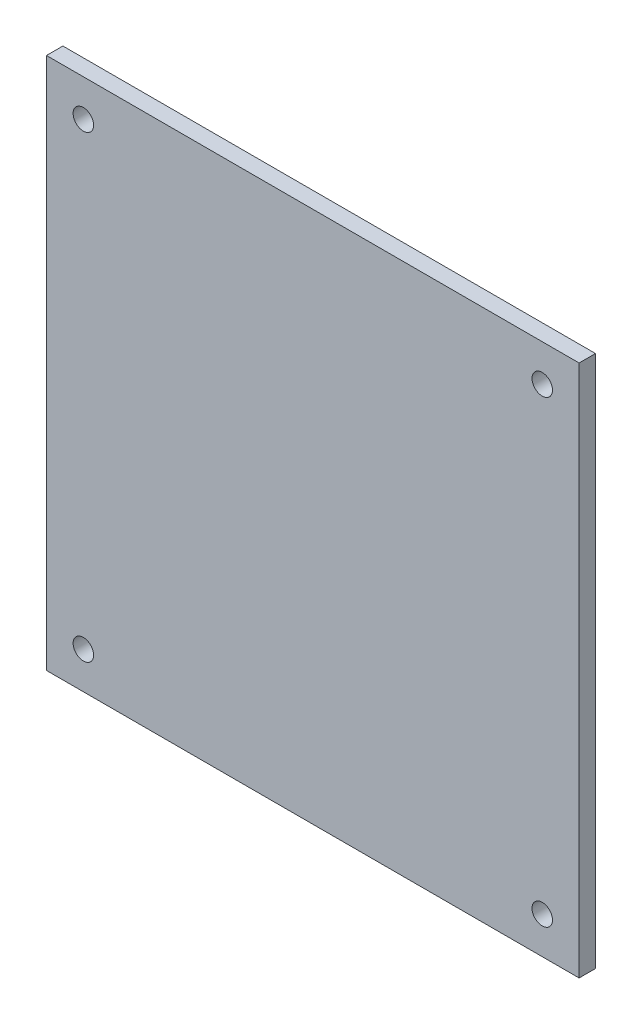
ISO-10303-21;
HEADER;
FILE_DESCRIPTION(('STEP AP214'),'2;1');
FILE_NAME('part.step','',(''),(''),'','','');
FILE_SCHEMA(('AUTOMOTIVE_DESIGN { 1 0 10303 214 1 1 1 1 }'));
ENDSEC;
DATA;
#1=APPLICATION_CONTEXT('core data for automotive mechanical design processes');
#2=APPLICATION_PROTOCOL_DEFINITION('international standard','automotive_design',2000,#1);
#3=PRODUCT_CONTEXT('',#1,'mechanical');
#4=PRODUCT('Part','Part','',(#3));
#5=PRODUCT_RELATED_PRODUCT_CATEGORY('part','',(#4));
#6=PRODUCT_DEFINITION_FORMATION('','',#4);
#7=PRODUCT_DEFINITION_CONTEXT('part definition',#1,'design');
#8=PRODUCT_DEFINITION('design','',#6,#7);
#9=PRODUCT_DEFINITION_SHAPE('','',#8);
#10=(LENGTH_UNIT() NAMED_UNIT(*) SI_UNIT(.MILLI.,.METRE.));
#11=(NAMED_UNIT(*) PLANE_ANGLE_UNIT() SI_UNIT($,.RADIAN.));
#12=(NAMED_UNIT(*) SI_UNIT($,.STERADIAN.) SOLID_ANGLE_UNIT());
#13=UNCERTAINTY_MEASURE_WITH_UNIT(LENGTH_MEASURE(1.E-05),#10,'distance_accuracy_value','');
#14=(GEOMETRIC_REPRESENTATION_CONTEXT(3) GLOBAL_UNCERTAINTY_ASSIGNED_CONTEXT((#13)) GLOBAL_UNIT_ASSIGNED_CONTEXT((#10,
#11,#12)) REPRESENTATION_CONTEXT('',''));
#15=CARTESIAN_POINT('',(0.,0.,0.));
#16=DIRECTION('',(0.,0.,1.));
#17=DIRECTION('',(1.,0.,0.));
#18=AXIS2_PLACEMENT_3D('',#15,#16,#17);
#19=CARTESIAN_POINT('',(-65.,-65.,-2.));
#20=DIRECTION('',(-1.,0.,0.));
#21=DIRECTION('',(0.,0.,1.));
#22=AXIS2_PLACEMENT_3D('',#19,#20,#21);
#23=PLANE('',#22);
#24=DIRECTION('',(0.,0.,1.));
#25=VECTOR('',#24,1.);
#26=CARTESIAN_POINT('',(-65.,-65.,-2.));
#27=LINE('',#26,#25);
#28=CARTESIAN_POINT('',(-65.,-65.,-2.));
#29=VERTEX_POINT('',#28);
#30=CARTESIAN_POINT('',(-65.,-65.,2.));
#31=VERTEX_POINT('',#30);
#32=EDGE_CURVE('E52',#29,#31,#27,.T.);
#33=ORIENTED_EDGE('',*,*,#32,.T.);
#34=DIRECTION('',(0.,-1.,0.));
#35=VECTOR('',#34,1.);
#36=CARTESIAN_POINT('',(-65.,-65.,2.));
#37=LINE('',#36,#35);
#38=CARTESIAN_POINT('',(-65.,65.,2.));
#39=VERTEX_POINT('',#38);
#40=EDGE_CURVE('E89',#39,#31,#37,.T.);
#41=ORIENTED_EDGE('',*,*,#40,.F.);
#42=DIRECTION('',(0.,0.,1.));
#43=VECTOR('',#42,1.);
#44=CARTESIAN_POINT('',(-65.,65.,-2.));
#45=LINE('',#44,#43);
#46=CARTESIAN_POINT('',(-65.,65.,-2.));
#47=VERTEX_POINT('',#46);
#48=EDGE_CURVE('E13',#47,#39,#45,.T.);
#49=ORIENTED_EDGE('',*,*,#48,.F.);
#50=DIRECTION('',(0.,-1.,0.));
#51=VECTOR('',#50,1.);
#52=CARTESIAN_POINT('',(-65.,-65.,-2.));
#53=LINE('',#52,#51);
#54=EDGE_CURVE('E90',#47,#29,#53,.T.);
#55=ORIENTED_EDGE('',*,*,#54,.T.);
#56=EDGE_LOOP('',(#33,#41,#49,#55));
#57=FACE_BOUND('',#56,.T.);
#58=ADVANCED_FACE('F49',(#57),#23,.T.);
#59=CARTESIAN_POINT('',(65.,65.,-2.));
#60=DIRECTION('',(0.,1.,0.));
#61=DIRECTION('',(0.,0.,1.));
#62=AXIS2_PLACEMENT_3D('',#59,#60,#61);
#63=PLANE('',#62);
#64=ORIENTED_EDGE('',*,*,#48,.T.);
#65=DIRECTION('',(-1.,0.,0.));
#66=VECTOR('',#65,1.);
#67=CARTESIAN_POINT('',(65.,65.,2.));
#68=LINE('',#67,#66);
#69=CARTESIAN_POINT('',(65.,65.,2.));
#70=VERTEX_POINT('',#69);
#71=EDGE_CURVE('E106',#70,#39,#68,.T.);
#72=ORIENTED_EDGE('',*,*,#71,.F.);
#73=DIRECTION('',(0.,0.,1.));
#74=VECTOR('',#73,1.);
#75=CARTESIAN_POINT('',(65.,65.,-2.));
#76=LINE('',#75,#74);
#77=CARTESIAN_POINT('',(65.,65.,-2.));
#78=VERTEX_POINT('',#77);
#79=EDGE_CURVE('E57',#78,#70,#76,.T.);
#80=ORIENTED_EDGE('',*,*,#79,.F.);
#81=DIRECTION('',(-1.,0.,0.));
#82=VECTOR('',#81,1.);
#83=CARTESIAN_POINT('',(65.,65.,-2.));
#84=LINE('',#83,#82);
#85=EDGE_CURVE('E95',#78,#47,#84,.T.);
#86=ORIENTED_EDGE('',*,*,#85,.T.);
#87=EDGE_LOOP('',(#64,#72,#80,#86));
#88=FACE_BOUND('',#87,.T.);
#89=ADVANCED_FACE('F126',(#88),#63,.T.);
#90=CARTESIAN_POINT('',(65.,-65.,-2.));
#91=DIRECTION('',(1.,0.,0.));
#92=DIRECTION('',(0.,0.,-1.));
#93=AXIS2_PLACEMENT_3D('',#90,#91,#92);
#94=PLANE('',#93);
#95=ORIENTED_EDGE('',*,*,#79,.T.);
#96=DIRECTION('',(0.,1.,0.));
#97=VECTOR('',#96,1.);
#98=CARTESIAN_POINT('',(65.,-65.,2.));
#99=LINE('',#98,#97);
#100=CARTESIAN_POINT('',(65.,-65.,2.));
#101=VERTEX_POINT('',#100);
#102=EDGE_CURVE('E102',#101,#70,#99,.T.);
#103=ORIENTED_EDGE('',*,*,#102,.F.);
#104=DIRECTION('',(0.,0.,1.));
#105=VECTOR('',#104,1.);
#106=CARTESIAN_POINT('',(65.,-65.,-2.));
#107=LINE('',#106,#105);
#108=CARTESIAN_POINT('',(65.,-65.,-2.));
#109=VERTEX_POINT('',#108);
#110=EDGE_CURVE('E94',#109,#101,#107,.T.);
#111=ORIENTED_EDGE('',*,*,#110,.F.);
#112=DIRECTION('',(0.,1.,0.));
#113=VECTOR('',#112,1.);
#114=CARTESIAN_POINT('',(65.,-65.,-2.));
#115=LINE('',#114,#113);
#116=EDGE_CURVE('E119',#109,#78,#115,.T.);
#117=ORIENTED_EDGE('',*,*,#116,.T.);
#118=EDGE_LOOP('',(#95,#103,#111,#117));
#119=FACE_BOUND('',#118,.T.);
#120=ADVANCED_FACE('F123',(#119),#94,.T.);
#121=CARTESIAN_POINT('',(65.,-65.,-2.));
#122=DIRECTION('',(0.,-1.,0.));
#123=DIRECTION('',(1.,0.,0.));
#124=AXIS2_PLACEMENT_3D('',#121,#122,#123);
#125=PLANE('',#124);
#126=ORIENTED_EDGE('',*,*,#110,.T.);
#127=DIRECTION('',(1.,0.,0.));
#128=VECTOR('',#127,1.);
#129=CARTESIAN_POINT('',(65.,-65.,2.));
#130=LINE('',#129,#128);
#131=EDGE_CURVE('E97',#31,#101,#130,.T.);
#132=ORIENTED_EDGE('',*,*,#131,.F.);
#133=ORIENTED_EDGE('',*,*,#32,.F.);
#134=DIRECTION('',(1.,0.,0.));
#135=VECTOR('',#134,1.);
#136=CARTESIAN_POINT('',(65.,-65.,-2.));
#137=LINE('',#136,#135);
#138=EDGE_CURVE('E117',#29,#109,#137,.T.);
#139=ORIENTED_EDGE('',*,*,#138,.T.);
#140=EDGE_LOOP('',(#126,#132,#133,#139));
#141=FACE_BOUND('',#140,.T.);
#142=ADVANCED_FACE('F98',(#141),#125,.T.);
#143=CARTESIAN_POINT('',(0.,0.,-2.));
#144=DIRECTION('',(0.,0.,1.));
#145=DIRECTION('',(1.,0.,0.));
#146=AXIS2_PLACEMENT_3D('',#143,#144,#145);
#147=PLANE('',#146);
#148=CARTESIAN_POINT('',(56.,56.,-2.));
#149=DIRECTION('',(0.,0.,-1.));
#150=DIRECTION('',(-1.,0.,0.));
#151=AXIS2_PLACEMENT_3D('',#148,#149,#150);
#152=CIRCLE('',#151,2.49999999999999);
#153=CARTESIAN_POINT('',(53.5,56.,-2.));
#154=VERTEX_POINT('',#153);
#155=EDGE_CURVE('E214',#154,#154,#152,.T.);
#156=ORIENTED_EDGE('',*,*,#155,.F.);
#157=EDGE_LOOP('',(#156));
#158=FACE_BOUND('',#157,.T.);
#159=CARTESIAN_POINT('',(-56.,56.,-2.));
#160=DIRECTION('',(0.,0.,-1.));
#161=DIRECTION('',(-1.,0.,0.));
#162=AXIS2_PLACEMENT_3D('',#159,#160,#161);
#163=CIRCLE('',#162,2.49999999999999);
#164=CARTESIAN_POINT('',(-58.5,56.,-2.));
#165=VERTEX_POINT('',#164);
#166=EDGE_CURVE('E216',#165,#165,#163,.T.);
#167=ORIENTED_EDGE('',*,*,#166,.F.);
#168=EDGE_LOOP('',(#167));
#169=FACE_BOUND('',#168,.T.);
#170=CARTESIAN_POINT('',(-56.,-56.,-2.));
#171=DIRECTION('',(0.,0.,-1.));
#172=DIRECTION('',(-1.,0.,0.));
#173=AXIS2_PLACEMENT_3D('',#170,#171,#172);
#174=CIRCLE('',#173,2.49999999999999);
#175=CARTESIAN_POINT('',(-58.5,-56.,-2.));
#176=VERTEX_POINT('',#175);
#177=EDGE_CURVE('E224',#176,#176,#174,.T.);
#178=ORIENTED_EDGE('',*,*,#177,.F.);
#179=EDGE_LOOP('',(#178));
#180=FACE_BOUND('',#179,.T.);
#181=CARTESIAN_POINT('',(56.,-56.,-2.));
#182=DIRECTION('',(0.,0.,-1.));
#183=DIRECTION('',(-1.,0.,0.));
#184=AXIS2_PLACEMENT_3D('',#181,#182,#183);
#185=CIRCLE('',#184,2.49999999999999);
#186=CARTESIAN_POINT('',(53.5,-56.,-2.));
#187=VERTEX_POINT('',#186);
#188=EDGE_CURVE('E110',#187,#187,#185,.T.);
#189=ORIENTED_EDGE('',*,*,#188,.F.);
#190=EDGE_LOOP('',(#189));
#191=FACE_BOUND('',#190,.T.);
#192=ORIENTED_EDGE('',*,*,#54,.F.);
#193=ORIENTED_EDGE('',*,*,#85,.F.);
#194=ORIENTED_EDGE('',*,*,#116,.F.);
#195=ORIENTED_EDGE('',*,*,#138,.F.);
#196=EDGE_LOOP('',(#192,#193,#194,#195));
#197=FACE_BOUND('',#196,.T.);
#198=ADVANCED_FACE('F128',(#158,#169,#180,#191,#197),#147,.F.);
#199=CARTESIAN_POINT('',(0.,0.,2.));
#200=DIRECTION('',(0.,0.,1.));
#201=DIRECTION('',(1.,0.,0.));
#202=AXIS2_PLACEMENT_3D('',#199,#200,#201);
#203=PLANE('',#202);
#204=CARTESIAN_POINT('',(56.,56.,2.));
#205=DIRECTION('',(0.,0.,-1.));
#206=DIRECTION('',(-1.,0.,0.));
#207=AXIS2_PLACEMENT_3D('',#204,#205,#206);
#208=CIRCLE('',#207,2.5);
#209=CARTESIAN_POINT('',(53.5,56.,2.));
#210=VERTEX_POINT('',#209);
#211=EDGE_CURVE('E212',#210,#210,#208,.T.);
#212=ORIENTED_EDGE('',*,*,#211,.T.);
#213=EDGE_LOOP('',(#212));
#214=FACE_BOUND('',#213,.T.);
#215=CARTESIAN_POINT('',(-56.,56.,2.));
#216=DIRECTION('',(0.,0.,-1.));
#217=DIRECTION('',(-1.,0.,0.));
#218=AXIS2_PLACEMENT_3D('',#215,#216,#217);
#219=CIRCLE('',#218,2.5);
#220=CARTESIAN_POINT('',(-58.5,56.,2.));
#221=VERTEX_POINT('',#220);
#222=EDGE_CURVE('E221',#221,#221,#219,.T.);
#223=ORIENTED_EDGE('',*,*,#222,.T.);
#224=EDGE_LOOP('',(#223));
#225=FACE_BOUND('',#224,.T.);
#226=CARTESIAN_POINT('',(-56.,-56.,2.));
#227=DIRECTION('',(0.,0.,-1.));
#228=DIRECTION('',(-1.,0.,0.));
#229=AXIS2_PLACEMENT_3D('',#226,#227,#228);
#230=CIRCLE('',#229,2.5);
#231=CARTESIAN_POINT('',(-58.5,-56.,2.));
#232=VERTEX_POINT('',#231);
#233=EDGE_CURVE('E227',#232,#232,#230,.T.);
#234=ORIENTED_EDGE('',*,*,#233,.T.);
#235=EDGE_LOOP('',(#234));
#236=FACE_BOUND('',#235,.T.);
#237=CARTESIAN_POINT('',(56.,-56.,2.));
#238=DIRECTION('',(0.,0.,-1.));
#239=DIRECTION('',(-1.,0.,0.));
#240=AXIS2_PLACEMENT_3D('',#237,#238,#239);
#241=CIRCLE('',#240,2.5);
#242=CARTESIAN_POINT('',(53.5,-56.,2.));
#243=VERTEX_POINT('',#242);
#244=EDGE_CURVE('E107',#243,#243,#241,.T.);
#245=ORIENTED_EDGE('',*,*,#244,.T.);
#246=EDGE_LOOP('',(#245));
#247=FACE_BOUND('',#246,.T.);
#248=ORIENTED_EDGE('',*,*,#40,.T.);
#249=ORIENTED_EDGE('',*,*,#131,.T.);
#250=ORIENTED_EDGE('',*,*,#102,.T.);
#251=ORIENTED_EDGE('',*,*,#71,.T.);
#252=EDGE_LOOP('',(#248,#249,#250,#251));
#253=FACE_BOUND('',#252,.T.);
#254=ADVANCED_FACE('F105',(#214,#225,#236,#247,#253),#203,.T.);
#255=CARTESIAN_POINT('',(56.,-56.,-2.));
#256=DIRECTION('',(0.,0.,-1.));
#257=DIRECTION('',(-1.,0.,0.));
#258=AXIS2_PLACEMENT_3D('',#255,#256,#257);
#259=CYLINDRICAL_SURFACE('',#258,2.5);
#260=ORIENTED_EDGE('',*,*,#244,.F.);
#261=EDGE_LOOP('',(#260));
#262=FACE_BOUND('',#261,.T.);
#263=ORIENTED_EDGE('',*,*,#188,.T.);
#264=EDGE_LOOP('',(#263));
#265=FACE_BOUND('',#264,.T.);
#266=ADVANCED_FACE('F136',(#262,#265),#259,.F.);
#267=CARTESIAN_POINT('',(-56.,-56.,-2.));
#268=DIRECTION('',(0.,0.,-1.));
#269=DIRECTION('',(-1.,0.,0.));
#270=AXIS2_PLACEMENT_3D('',#267,#268,#269);
#271=CYLINDRICAL_SURFACE('',#270,2.5);
#272=ORIENTED_EDGE('',*,*,#233,.F.);
#273=EDGE_LOOP('',(#272));
#274=FACE_BOUND('',#273,.T.);
#275=ORIENTED_EDGE('',*,*,#177,.T.);
#276=EDGE_LOOP('',(#275));
#277=FACE_BOUND('',#276,.T.);
#278=ADVANCED_FACE('F175',(#274,#277),#271,.F.);
#279=CARTESIAN_POINT('',(-56.,56.,-2.));
#280=DIRECTION('',(0.,0.,-1.));
#281=DIRECTION('',(-1.,0.,0.));
#282=AXIS2_PLACEMENT_3D('',#279,#280,#281);
#283=CYLINDRICAL_SURFACE('',#282,2.5);
#284=ORIENTED_EDGE('',*,*,#222,.F.);
#285=EDGE_LOOP('',(#284));
#286=FACE_BOUND('',#285,.T.);
#287=ORIENTED_EDGE('',*,*,#166,.T.);
#288=EDGE_LOOP('',(#287));
#289=FACE_BOUND('',#288,.T.);
#290=ADVANCED_FACE('F185',(#286,#289),#283,.F.);
#291=CARTESIAN_POINT('',(56.,56.,-2.));
#292=DIRECTION('',(0.,0.,-1.));
#293=DIRECTION('',(-1.,0.,0.));
#294=AXIS2_PLACEMENT_3D('',#291,#292,#293);
#295=CYLINDRICAL_SURFACE('',#294,2.5);
#296=ORIENTED_EDGE('',*,*,#211,.F.);
#297=EDGE_LOOP('',(#296));
#298=FACE_BOUND('',#297,.T.);
#299=ORIENTED_EDGE('',*,*,#155,.T.);
#300=EDGE_LOOP('',(#299));
#301=FACE_BOUND('',#300,.T.);
#302=ADVANCED_FACE('F195',(#298,#301),#295,.F.);
#303=CLOSED_SHELL('',(#58,#89,#120,#142,#198,#254,#266,#278,#290,#302));
#304=MANIFOLD_SOLID_BREP('B2',#303);
#305=ADVANCED_BREP_SHAPE_REPRESENTATION('',(#18,#304),#14);
#306=SHAPE_DEFINITION_REPRESENTATION(#9,#305);
ENDSEC;
END-ISO-10303-21;
